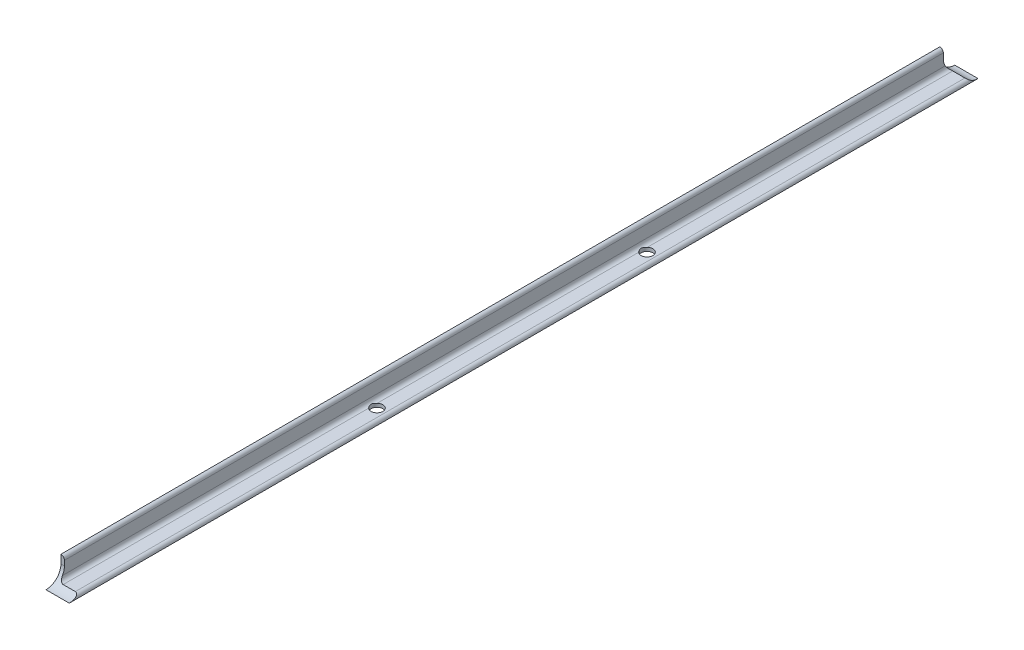
ISO-10303-21;
HEADER;
FILE_DESCRIPTION(('STEP AP214'),'2;1');
FILE_NAME('part.step','',(''),(''),'','','');
FILE_SCHEMA(('AUTOMOTIVE_DESIGN { 1 0 10303 214 1 1 1 1 }'));
ENDSEC;
DATA;
#1=APPLICATION_CONTEXT('core data for automotive mechanical design processes');
#2=APPLICATION_PROTOCOL_DEFINITION('international standard','automotive_design',2000,#1);
#3=PRODUCT_CONTEXT('',#1,'mechanical');
#4=PRODUCT('Part','Part','',(#3));
#5=PRODUCT_RELATED_PRODUCT_CATEGORY('part','',(#4));
#6=PRODUCT_DEFINITION_FORMATION('','',#4);
#7=PRODUCT_DEFINITION_CONTEXT('part definition',#1,'design');
#8=PRODUCT_DEFINITION('design','',#6,#7);
#9=PRODUCT_DEFINITION_SHAPE('','',#8);
#10=(LENGTH_UNIT() NAMED_UNIT(*) SI_UNIT(.MILLI.,.METRE.));
#11=(NAMED_UNIT(*) PLANE_ANGLE_UNIT() SI_UNIT($,.RADIAN.));
#12=(NAMED_UNIT(*) SI_UNIT($,.STERADIAN.) SOLID_ANGLE_UNIT());
#13=UNCERTAINTY_MEASURE_WITH_UNIT(LENGTH_MEASURE(1.E-05),#10,'distance_accuracy_value','');
#14=(GEOMETRIC_REPRESENTATION_CONTEXT(3) GLOBAL_UNCERTAINTY_ASSIGNED_CONTEXT((#13)) GLOBAL_UNIT_ASSIGNED_CONTEXT((#10,
#11,#12)) REPRESENTATION_CONTEXT('',''));
#15=CARTESIAN_POINT('',(0.,0.,0.));
#16=DIRECTION('',(0.,0.,1.));
#17=DIRECTION('',(1.,0.,0.));
#18=AXIS2_PLACEMENT_3D('',#15,#16,#17);
#19=CARTESIAN_POINT('',(3.,17.,181.370967741936));
#20=DIRECTION('',(-1.,0.,0.));
#21=DIRECTION('',(0.,-1.,0.));
#22=AXIS2_PLACEMENT_3D('',#19,#20,#21);
#23=PLANE('',#22);
#24=DIRECTION('',(0.,-1.,0.));
#25=VECTOR('',#24,1.);
#26=CARTESIAN_POINT('',(3.,17.,-586.529040244513));
#27=LINE('',#26,#25);
#28=CARTESIAN_POINT('',(3.,17.,-586.529040244513));
#29=VERTEX_POINT('',#28);
#30=CARTESIAN_POINT('',(3.00000000000001,12.7857012931674,-586.529040244513));
#31=VERTEX_POINT('',#30);
#32=EDGE_CURVE('E275',#29,#31,#27,.T.);
#33=ORIENTED_EDGE('',*,*,#32,.F.);
#34=DIRECTION('',(0.,0.,-1.));
#35=VECTOR('',#34,1.);
#36=CARTESIAN_POINT('',(3.,17.,181.370967741936));
#37=LINE('',#36,#35);
#38=CARTESIAN_POINT('',(3.,17.,168.570975728384));
#39=VERTEX_POINT('',#38);
#40=EDGE_CURVE('E177',#39,#29,#37,.T.);
#41=ORIENTED_EDGE('',*,*,#40,.F.);
#42=DIRECTION('',(0.,-1.,0.));
#43=VECTOR('',#42,1.);
#44=CARTESIAN_POINT('',(3.,17.,168.570975728384));
#45=LINE('',#44,#43);
#46=CARTESIAN_POINT('',(3.00000000000001,12.7857012931674,168.570975728384));
#47=VERTEX_POINT('',#46);
#48=EDGE_CURVE('E194',#39,#47,#45,.T.);
#49=ORIENTED_EDGE('',*,*,#48,.T.);
#50=CARTESIAN_POINT('',(3.,12.8,181.370967741935));
#51=DIRECTION('',(-1.,0.,0.));
#52=DIRECTION('',(0.,-1.,0.));
#53=AXIS2_PLACEMENT_3D('',#50,#51,#52);
#54=CIRCLE('',#53,12.8);
#55=CARTESIAN_POINT('',(3.,6.5,170.228705853073));
#56=VERTEX_POINT('',#55);
#57=EDGE_CURVE('E230',#56,#47,#54,.F.);
#58=ORIENTED_EDGE('',*,*,#57,.F.);
#59=DIRECTION('',(0.,0.,-1.));
#60=VECTOR('',#59,1.);
#61=CARTESIAN_POINT('',(3.,6.5,181.370967741936));
#62=LINE('',#61,#60);
#63=CARTESIAN_POINT('',(3.,6.5,-588.186770369202));
#64=VERTEX_POINT('',#63);
#65=EDGE_CURVE('E172',#56,#64,#62,.T.);
#66=ORIENTED_EDGE('',*,*,#65,.T.);
#67=CARTESIAN_POINT('',(3.,12.8,-599.329032258065));
#68=DIRECTION('',(-1.,0.,0.));
#69=DIRECTION('',(0.,-1.,0.));
#70=AXIS2_PLACEMENT_3D('',#67,#68,#69);
#71=CIRCLE('',#70,12.8);
#72=EDGE_CURVE('E310',#64,#31,#71,.T.);
#73=ORIENTED_EDGE('',*,*,#72,.T.);
#74=EDGE_LOOP('',(#33,#41,#49,#58,#66,#73));
#75=FACE_BOUND('',#74,.T.);
#76=ADVANCED_FACE('F62',(#75),#23,.F.);
#77=CARTESIAN_POINT('',(0.,0.,181.370967741936));
#78=DIRECTION('',(1.,0.,0.));
#79=DIRECTION('',(0.,0.,-1.));
#80=AXIS2_PLACEMENT_3D('',#77,#78,#79);
#81=PLANE('',#80);
#82=DIRECTION('',(0.,-1.,0.));
#83=VECTOR('',#82,1.);
#84=CARTESIAN_POINT('',(0.,0.,-586.529040244513));
#85=LINE('',#84,#83);
#86=CARTESIAN_POINT('',(0.,20.,-586.529040244513));
#87=VERTEX_POINT('',#86);
#88=CARTESIAN_POINT('',(0.,12.7857012931674,-586.529040244513));
#89=VERTEX_POINT('',#88);
#90=EDGE_CURVE('E305',#87,#89,#85,.T.);
#91=ORIENTED_EDGE('',*,*,#90,.T.);
#92=CARTESIAN_POINT('',(0.,12.8,-599.329032258065));
#93=DIRECTION('',(-1.,0.,0.));
#94=DIRECTION('',(0.,0.,1.));
#95=AXIS2_PLACEMENT_3D('',#92,#93,#94);
#96=CIRCLE('',#95,12.8);
#97=CARTESIAN_POINT('',(0.,0.,-599.329032258065));
#98=VERTEX_POINT('',#97);
#99=EDGE_CURVE('E308',#98,#89,#96,.T.);
#100=ORIENTED_EDGE('',*,*,#99,.F.);
#101=DIRECTION('',(0.,0.,-1.));
#102=VECTOR('',#101,1.);
#103=CARTESIAN_POINT('',(0.,0.,181.370967741936));
#104=LINE('',#103,#102);
#105=CARTESIAN_POINT('',(0.,0.,181.370967741936));
#106=VERTEX_POINT('',#105);
#107=EDGE_CURVE('E187',#106,#98,#104,.T.);
#108=ORIENTED_EDGE('',*,*,#107,.F.);
#109=CARTESIAN_POINT('',(0.,12.8,181.370967741935));
#110=DIRECTION('',(-1.,0.,0.));
#111=DIRECTION('',(0.,0.,1.));
#112=AXIS2_PLACEMENT_3D('',#109,#110,#111);
#113=CIRCLE('',#112,12.8);
#114=CARTESIAN_POINT('',(0.,12.7857012931674,168.570975728384));
#115=VERTEX_POINT('',#114);
#116=EDGE_CURVE('E278',#106,#115,#113,.F.);
#117=ORIENTED_EDGE('',*,*,#116,.T.);
#118=DIRECTION('',(0.,-1.,0.));
#119=VECTOR('',#118,1.);
#120=CARTESIAN_POINT('',(0.,0.,168.570975728384));
#121=LINE('',#120,#119);
#122=CARTESIAN_POINT('',(0.,20.,168.570975728384));
#123=VERTEX_POINT('',#122);
#124=EDGE_CURVE('E281',#123,#115,#121,.T.);
#125=ORIENTED_EDGE('',*,*,#124,.F.);
#126=DIRECTION('',(0.,0.,-1.));
#127=VECTOR('',#126,1.);
#128=CARTESIAN_POINT('',(0.,20.,181.370967741936));
#129=LINE('',#128,#127);
#130=EDGE_CURVE('E182',#123,#87,#129,.T.);
#131=ORIENTED_EDGE('',*,*,#130,.T.);
#132=EDGE_LOOP('',(#91,#100,#108,#117,#125,#131));
#133=FACE_BOUND('',#132,.T.);
#134=ADVANCED_FACE('F222',(#133),#81,.F.);
#135=CARTESIAN_POINT('',(0.,17.,181.370967741936));
#136=DIRECTION('',(0.,0.,-1.));
#137=DIRECTION('',(-1.,0.,0.));
#138=AXIS2_PLACEMENT_3D('',#135,#136,#137);
#139=CYLINDRICAL_SURFACE('',#138,3.);
#140=CARTESIAN_POINT('',(0.,17.,-586.529040244513));
#141=DIRECTION('',(0.,0.,-1.));
#142=DIRECTION('',(-1.,0.,0.));
#143=AXIS2_PLACEMENT_3D('',#140,#141,#142);
#144=CIRCLE('',#143,3.);
#145=EDGE_CURVE('E252',#87,#29,#144,.T.);
#146=ORIENTED_EDGE('',*,*,#145,.F.);
#147=ORIENTED_EDGE('',*,*,#130,.F.);
#148=CARTESIAN_POINT('',(0.,17.,168.570975728384));
#149=DIRECTION('',(0.,0.,-1.));
#150=DIRECTION('',(-1.,0.,0.));
#151=AXIS2_PLACEMENT_3D('',#148,#149,#150);
#152=CIRCLE('',#151,3.);
#153=EDGE_CURVE('E198',#123,#39,#152,.T.);
#154=ORIENTED_EDGE('',*,*,#153,.T.);
#155=ORIENTED_EDGE('',*,*,#40,.T.);
#156=EDGE_LOOP('',(#146,#147,#154,#155));
#157=FACE_BOUND('',#156,.T.);
#158=ADVANCED_FACE('F291',(#157),#139,.T.);
#159=CARTESIAN_POINT('',(17.,0.,181.370967741936));
#160=DIRECTION('',(0.,0.,-1.));
#161=DIRECTION('',(-1.,0.,0.));
#162=AXIS2_PLACEMENT_3D('',#159,#160,#161);
#163=CYLINDRICAL_SURFACE('',#162,3.);
#164=DIRECTION('',(0.,0.,-1.));
#165=VECTOR('',#164,1.);
#166=CARTESIAN_POINT('',(20.,0.,181.370967741936));
#167=LINE('',#166,#165);
#168=CARTESIAN_POINT('',(20.,0.,181.370967741936));
#169=VERTEX_POINT('',#168);
#170=CARTESIAN_POINT('',(20.,0.,-599.329032258065));
#171=VERTEX_POINT('',#170);
#172=EDGE_CURVE('E169',#169,#171,#167,.T.);
#173=ORIENTED_EDGE('',*,*,#172,.T.);
#174=CARTESIAN_POINT('',(20.,0.,-599.329032258065));
#175=CARTESIAN_POINT('',(19.9999705919109,-2.30458043371341E-06,-599.151286959261));
#176=CARTESIAN_POINT('',(19.9999989770571,0.00370226592440799,-598.973541801661));
#177=CARTESIAN_POINT('',(19.9999599122282,0.0185087719111506,-598.618355839031));
#178=CARTESIAN_POINT('',(19.9998924600866,0.0296108746273837,-598.440915040973));
#179=CARTESIAN_POINT('',(19.9994499094464,0.0592209383889684,-598.086352009699));
#180=CARTESIAN_POINT('',(19.9990742937025,0.077741324078489,-597.909230814235));
#181=CARTESIAN_POINT('',(19.9975949282692,0.122154254291084,-597.555920397352));
#182=CARTESIAN_POINT('',(19.9964911898514,0.148046684689873,-597.379731161548));
#183=CARTESIAN_POINT('',(19.9929752074295,0.20732959146887,-597.027571761546));
#184=CARTESIAN_POINT('',(19.990555359875,0.240762970703626,-596.851608884925));
#185=CARTESIAN_POINT('',(19.9836522455287,0.31497391630333,-596.501280315793));
#186=CARTESIAN_POINT('',(19.9791690254037,0.355751316557959,-596.326914587251));
#187=CARTESIAN_POINT('',(19.967222709024,0.444514483171897,-595.980308753322));
#188=CARTESIAN_POINT('',(19.9597625459986,0.49249312508781,-595.808066727127));
#189=CARTESIAN_POINT('',(19.9407600650472,0.595547736239818,-595.465970487646));
#190=CARTESIAN_POINT('',(19.9292185156824,0.650622367998193,-595.296115831055));
#191=CARTESIAN_POINT('',(19.9024685493768,0.760575693164327,-594.979685982737));
#192=CARTESIAN_POINT('',(19.887874684371,0.8146679206681,-594.832786020236));
#193=CARTESIAN_POINT('',(19.853481433853,0.927982337980105,-594.541590472269));
#194=CARTESIAN_POINT('',(19.8336823059246,0.987204273846346,-594.397294758309));
#195=CARTESIAN_POINT('',(19.7876954025515,1.11044027648883,-594.111913254042));
#196=CARTESIAN_POINT('',(19.7615123704582,1.17445076092484,-593.970825165116));
#197=CARTESIAN_POINT('',(19.7013693405174,1.30686409439155,-593.692404327919));
#198=CARTESIAN_POINT('',(19.6674102916595,1.37526640670865,-593.555071123687));
#199=CARTESIAN_POINT('',(19.5957588590612,1.5055647848469,-593.304694396706));
#200=CARTESIAN_POINT('',(19.5593322138692,1.56695585378172,-593.191028274171));
#201=CARTESIAN_POINT('',(19.4785163705227,1.69189081979229,-592.967721539012));
#202=CARTESIAN_POINT('',(19.4341258880657,1.75543506276089,-592.858081579115));
#203=CARTESIAN_POINT('',(19.3362692288105,1.88370363459149,-592.643974007168));
#204=CARTESIAN_POINT('',(19.2828231460853,1.94842507345108,-592.539495590787));
#205=CARTESIAN_POINT('',(19.1655479709184,2.0779870281796,-592.336685701539));
#206=CARTESIAN_POINT('',(19.101725952208,2.14282743337525,-592.238350103626));
#207=CARTESIAN_POINT('',(18.9498231644929,2.2826944755246,-592.032154258203));
#208=CARTESIAN_POINT('',(18.859443382443,2.35745098877733,-591.925771184952));
#209=CARTESIAN_POINT('',(18.6607215587141,2.50140061225801,-591.72680223184));
#210=CARTESIAN_POINT('',(18.5523984627188,2.57059947737117,-591.634201992933));
#211=CARTESIAN_POINT('',(18.3377433168696,2.68750138374115,-591.481421994537));
#212=CARTESIAN_POINT('',(18.2343482603597,2.73684935436313,-591.418404616478));
#213=CARTESIAN_POINT('',(18.0157301558413,2.82526779578834,-591.307200865328));
#214=CARTESIAN_POINT('',(17.9005149294212,2.86434500270211,-591.259004768111));
#215=CARTESIAN_POINT('',(17.6772358802355,2.92452271028321,-591.185513498367));
#216=CARTESIAN_POINT('',(17.5703779091804,2.94735939747826,-591.157976395426));
#217=CARTESIAN_POINT('',(17.3522544969218,2.98127870354691,-591.117245847923));
#218=CARTESIAN_POINT('',(17.2409999263105,2.99238863543523,-591.104019071095));
#219=CARTESIAN_POINT('',(17.1077454898132,2.99814309911651,-591.097167444306));
#220=CARTESIAN_POINT('',(17.0862001547962,2.99883941073956,-591.096338319584));
#221=CARTESIAN_POINT('',(17.0431054203398,2.99976710034989,-591.095233756004));
#222=CARTESIAN_POINT('',(17.0215560434937,2.99999891199695,-591.094957800703));
#223=CARTESIAN_POINT('',(17.,3.,-591.094956717969));
#224=B_SPLINE_CURVE_WITH_KNOTS('',3,(#174,#175,#176,#177,#178,#179,#180,#181,#182,#183,#184,
#185,#186,#187,#188,#189,#190,#191,#192,#193,#194,#195,#196,#197,#198,#199,#200,#201,#202,#203,
#204,#205,#206,#207,#208,#209,#210,#211,#212,#213,#214,#215,#216,#217,#218,#219,#220,#221,#222,
#223),.UNSPECIFIED.,.F.,.F.,(4,2,2,2,2,2,2,2,2,2,2,2,2,2,2,2,2,2,2,2,2,2,2,2,4),(0.,
0.533197095279369,1.06640624483348,1.6005122087364,2.13460990476385,2.67182653411145,
3.20903101398106,3.74570747957585,4.28228293803236,4.7537765960874,5.22524692656231,
5.69636800828255,6.1674316247327,6.5698304355134,6.97229419829312,7.37387633093486,
7.77518582667769,8.24881684700335,8.72195092873458,9.11270874235859,9.50320963318574,
9.83984379905434,10.1756921618372,10.2404043939398,10.3050561821395),.UNSPECIFIED.);
#225=CARTESIAN_POINT('',(17.,3.,-591.094956717969));
#226=VERTEX_POINT('',#225);
#227=EDGE_CURVE('E268',#171,#226,#224,.T.);
#228=ORIENTED_EDGE('',*,*,#227,.T.);
#229=DIRECTION('',(0.,0.,-1.));
#230=VECTOR('',#229,1.);
#231=CARTESIAN_POINT('',(17.,3.,181.370967741936));
#232=LINE('',#231,#230);
#233=CARTESIAN_POINT('',(17.,3.,173.13689220184));
#234=VERTEX_POINT('',#233);
#235=EDGE_CURVE('E165',#234,#226,#232,.T.);
#236=ORIENTED_EDGE('',*,*,#235,.F.);
#237=CARTESIAN_POINT('',(20.,0.,181.370967741935));
#238=CARTESIAN_POINT('',(19.9999705919109,-2.30458042971439E-06,181.193222443132));
#239=CARTESIAN_POINT('',(19.9999989770571,0.00370226592441562,181.015477285531));
#240=CARTESIAN_POINT('',(19.9999599122282,0.018508771911162,180.660291322902));
#241=CARTESIAN_POINT('',(19.9998924600866,0.0296108746273938,180.482850524844));
#242=CARTESIAN_POINT('',(19.9994499094464,0.0592209383889723,180.12828749357));
#243=CARTESIAN_POINT('',(19.9990742937025,0.0777413240784908,179.951166298106));
#244=CARTESIAN_POINT('',(19.9975949282692,0.122154254291092,179.597855881223));
#245=CARTESIAN_POINT('',(19.9964911898514,0.14804668468989,179.421666645419));
#246=CARTESIAN_POINT('',(19.9929752074295,0.207329591468899,179.069507245417));
#247=CARTESIAN_POINT('',(19.990555359875,0.240762970703659,178.893544368796));
#248=CARTESIAN_POINT('',(19.9836522455287,0.314973916303364,178.543215799664));
#249=CARTESIAN_POINT('',(19.9791690254037,0.355751316557985,178.368850071122));
#250=CARTESIAN_POINT('',(19.967222709024,0.444514483171921,178.022244237193));
#251=CARTESIAN_POINT('',(19.9597625459986,0.49249312508784,177.850002210998));
#252=CARTESIAN_POINT('',(19.9407600650472,0.595547736239846,177.507905971517));
#253=CARTESIAN_POINT('',(19.9292185156824,0.650622367998212,177.338051314926));
#254=CARTESIAN_POINT('',(19.9024685493768,0.760575693164334,177.021621466608));
#255=CARTESIAN_POINT('',(19.887874684371,0.814667920668103,176.874721504107));
#256=CARTESIAN_POINT('',(19.853481433853,0.927982337980103,176.58352595614));
#257=CARTESIAN_POINT('',(19.8336823059246,0.987204273846344,176.43923024218));
#258=CARTESIAN_POINT('',(19.7876954025515,1.11044027648881,176.153848737913));
#259=CARTESIAN_POINT('',(19.7615123704582,1.1744507609248,176.012760648987));
#260=CARTESIAN_POINT('',(19.7013693405175,1.30686409439148,175.73433981179));
#261=CARTESIAN_POINT('',(19.6674102916596,1.37526640670857,175.597006607558));
#262=CARTESIAN_POINT('',(19.5957588590613,1.50556478484685,175.346629880577));
#263=CARTESIAN_POINT('',(19.5593322138692,1.56695585378169,175.232963758042));
#264=CARTESIAN_POINT('',(19.4785163705227,1.69189081979228,175.009657022883));
#265=CARTESIAN_POINT('',(19.4341258880657,1.75543506276087,174.900017062986));
#266=CARTESIAN_POINT('',(19.3362692288105,1.88370363459147,174.685909491039));
#267=CARTESIAN_POINT('',(19.2828231460854,1.94842507345107,174.581431074658));
#268=CARTESIAN_POINT('',(19.1655479709184,2.07798702817959,174.37862118541));
#269=CARTESIAN_POINT('',(19.101725952208,2.14282743337524,174.280285587497));
#270=CARTESIAN_POINT('',(18.949823164493,2.28269447552458,174.074089742074));
#271=CARTESIAN_POINT('',(18.859443382443,2.35745098877729,173.967706668823));
#272=CARTESIAN_POINT('',(18.6607215587142,2.50140061225799,173.768737715711));
#273=CARTESIAN_POINT('',(18.5523984627189,2.57059947737116,173.676137476804));
#274=CARTESIAN_POINT('',(18.3377433168696,2.68750138374115,173.523357478408));
#275=CARTESIAN_POINT('',(18.2343482603598,2.73684935436311,173.460340100349));
#276=CARTESIAN_POINT('',(18.0157301558414,2.82526779578833,173.349136349199));
#277=CARTESIAN_POINT('',(17.9005149294213,2.8643450027021,173.300940251982));
#278=CARTESIAN_POINT('',(17.6772358802356,2.9245227102832,173.227448982238));
#279=CARTESIAN_POINT('',(17.5703779091804,2.94735939747825,173.199911879297));
#280=CARTESIAN_POINT('',(17.3522544969218,2.9812787035469,173.159181331794));
#281=CARTESIAN_POINT('',(17.2409999263106,2.99238863543523,173.145954554966));
#282=CARTESIAN_POINT('',(17.1077454898132,2.99814309911651,173.139102928177));
#283=CARTESIAN_POINT('',(17.0862001547962,2.99883941073956,173.138273803455));
#284=CARTESIAN_POINT('',(17.0431054203398,2.99976710034989,173.137169239875));
#285=CARTESIAN_POINT('',(17.0215560434937,2.99999891199695,173.136893284574));
#286=CARTESIAN_POINT('',(17.,3.,173.13689220184));
#287=B_SPLINE_CURVE_WITH_KNOTS('',3,(#237,#238,#239,#240,#241,#242,#243,#244,#245,#246,#247,
#248,#249,#250,#251,#252,#253,#254,#255,#256,#257,#258,#259,#260,#261,#262,#263,#264,#265,#266,
#267,#268,#269,#270,#271,#272,#273,#274,#275,#276,#277,#278,#279,#280,#281,#282,#283,#284,#285,
#286),.UNSPECIFIED.,.F.,.F.,(4,2,2,2,2,2,2,2,2,2,2,2,2,2,2,2,2,2,2,2,2,2,2,2,4),(0.,
0.533197095279341,1.06640624483331,1.60051220873628,2.13460990476385,2.67182653411162,
3.20903101398112,3.74570747957588,4.28228293803237,4.75377659608731,5.2252469265622,
5.69636800828244,6.16743162473253,6.56983043551339,6.97229419829308,7.37387633093474,
7.77518582667765,8.24881684700328,8.72195092873456,9.11270874235853,9.50320963318567,
9.83984379905428,10.1756921618371,10.2404043939398,10.3050561821395),.UNSPECIFIED.);
#288=EDGE_CURVE('E201',#169,#234,#287,.T.);
#289=ORIENTED_EDGE('',*,*,#288,.F.);
#290=EDGE_LOOP('',(#173,#228,#236,#289));
#291=FACE_BOUND('',#290,.T.);
#292=ADVANCED_FACE('F210',(#291),#163,.T.);
#293=CARTESIAN_POINT('',(6.5,3.,181.370967741936));
#294=DIRECTION('',(0.,-1.,0.));
#295=DIRECTION('',(0.,0.,-1.));
#296=AXIS2_PLACEMENT_3D('',#293,#294,#295);
#297=PLANE('',#296);
#298=DIRECTION('',(0.,0.,-1.));
#299=VECTOR('',#298,1.);
#300=CARTESIAN_POINT('',(6.5,3.,181.370967741936));
#301=LINE('',#300,#299);
#302=CARTESIAN_POINT('',(6.5,3.,-96.6081858246692));
#303=VERTEX_POINT('',#302);
#304=CARTESIAN_POINT('',(6.5,3.,-321.34987869146));
#305=VERTEX_POINT('',#304);
#306=EDGE_CURVE('E157',#303,#305,#301,.T.);
#307=ORIENTED_EDGE('',*,*,#306,.F.);
#308=CARTESIAN_POINT('',(10.,3.,-92.9790322580645));
#309=DIRECTION('',(0.,-1.,0.));
#310=DIRECTION('',(0.,0.,-1.));
#311=AXIS2_PLACEMENT_3D('',#308,#309,#310);
#312=CIRCLE('',#311,5.0419);
#313=CARTESIAN_POINT('',(6.50000000000004,3.,-89.3498786914598));
#314=VERTEX_POINT('',#313);
#315=EDGE_CURVE('E82',#303,#314,#312,.T.);
#316=ORIENTED_EDGE('',*,*,#315,.T.);
#317=CARTESIAN_POINT('',(6.5,3.,173.13689220184));
#318=VERTEX_POINT('',#317);
#319=EDGE_CURVE('E156',#318,#314,#301,.T.);
#320=ORIENTED_EDGE('',*,*,#319,.F.);
#321=DIRECTION('',(-1.,0.,0.));
#322=VECTOR('',#321,1.);
#323=CARTESIAN_POINT('',(20.,3.,173.13689220184));
#324=LINE('',#323,#322);
#325=EDGE_CURVE('E208',#234,#318,#324,.T.);
#326=ORIENTED_EDGE('',*,*,#325,.F.);
#327=ORIENTED_EDGE('',*,*,#235,.T.);
#328=DIRECTION('',(-1.,0.,0.));
#329=VECTOR('',#328,1.);
#330=CARTESIAN_POINT('',(20.,3.,-591.094956717969));
#331=LINE('',#330,#329);
#332=CARTESIAN_POINT('',(6.5,3.,-591.094956717969));
#333=VERTEX_POINT('',#332);
#334=EDGE_CURVE('E276',#226,#333,#331,.T.);
#335=ORIENTED_EDGE('',*,*,#334,.T.);
#336=CARTESIAN_POINT('',(6.5,3.,-328.608185824669));
#337=VERTEX_POINT('',#336);
#338=EDGE_CURVE('E167',#337,#333,#301,.T.);
#339=ORIENTED_EDGE('',*,*,#338,.F.);
#340=CARTESIAN_POINT('',(10.,3.,-324.979032258065));
#341=DIRECTION('',(0.,-1.,0.));
#342=DIRECTION('',(0.,0.,-1.));
#343=AXIS2_PLACEMENT_3D('',#340,#341,#342);
#344=CIRCLE('',#343,5.0419);
#345=EDGE_CURVE('E88',#337,#305,#344,.T.);
#346=ORIENTED_EDGE('',*,*,#345,.T.);
#347=EDGE_LOOP('',(#307,#316,#320,#326,#327,#335,#339,#346));
#348=FACE_BOUND('',#347,.T.);
#349=ADVANCED_FACE('F154',(#348),#297,.F.);
#350=CARTESIAN_POINT('',(6.5,6.5,181.370967741936));
#351=DIRECTION('',(0.,0.,-1.));
#352=DIRECTION('',(-1.,0.,0.));
#353=AXIS2_PLACEMENT_3D('',#350,#351,#352);
#354=CYLINDRICAL_SURFACE('',#353,3.5);
#355=ORIENTED_EDGE('',*,*,#319,.T.);
#356=CARTESIAN_POINT('',(6.50000000000004,3.,-89.3498786914598));
#357=CARTESIAN_POINT('',(6.39204719065244,3.00001655555881,-89.4539508827214));
#358=CARTESIAN_POINT('',(6.28888615444547,3.0049911532147,-89.5627700011741));
#359=CARTESIAN_POINT('',(6.09302596682158,3.02235029089313,-89.7886493910553));
#360=CARTESIAN_POINT('',(6.00031175048824,3.03472399415071,-89.9056973896282));
#361=CARTESIAN_POINT('',(5.82598131029803,3.06437664200858,-90.1469850670852));
#362=CARTESIAN_POINT('',(5.74435529874184,3.08165121838745,-90.2712182635401));
#363=CARTESIAN_POINT('',(5.59249766633415,3.11879424133783,-90.5261383661917));
#364=CARTESIAN_POINT('',(5.52226932097811,3.13866343060692,-90.656827113579));
#365=CARTESIAN_POINT('',(5.40098938132326,3.17648763076033,-90.9085073506793));
#366=CARTESIAN_POINT('',(5.34866236243366,3.19440098489456,-91.0288932040351));
#367=CARTESIAN_POINT('',(5.25350719060877,3.22909468916167,-91.2735174265388));
#368=CARTESIAN_POINT('',(5.21067819585063,3.24587513961357,-91.3977554531499));
#369=CARTESIAN_POINT('',(5.13482397245432,3.27696180361262,-91.6493480358244));
#370=CARTESIAN_POINT('',(5.10178796429087,3.29127073036559,-91.7766989968934));
#371=CARTESIAN_POINT('',(5.0457189810416,3.31628972163657,-92.0339477565181));
#372=CARTESIAN_POINT('',(5.02268655134614,3.32699958992843,-92.1638456935302));
#373=CARTESIAN_POINT('',(4.98579711282946,3.34442773609418,-92.4330854543745));
#374=CARTESIAN_POINT('',(4.97256326946486,3.35087250450926,-92.5725314793147));
#375=CARTESIAN_POINT('',(4.95775102669115,3.35809978185671,-92.8521923709976));
#376=CARTESIAN_POINT('',(4.95617278555464,3.35888221389965,-92.9924072481548));
#377=CARTESIAN_POINT('',(4.96469564571937,3.35470793773792,-93.2724621978725));
#378=CARTESIAN_POINT('',(4.97480247876197,3.34974841299738,-93.412302052741));
#379=CARTESIAN_POINT('',(5.00656919626948,3.33456610988518,-93.6903623612143));
#380=CARTESIAN_POINT('',(5.02822896466023,3.32434338439375,-93.828582831075));
#381=CARTESIAN_POINT('',(5.08062318999629,3.30060594245812,-94.09120204283));
#382=CARTESIAN_POINT('',(5.11047352677841,3.28742768614895,-94.2158087019582));
#383=CARTESIAN_POINT('',(5.17946312867952,3.25846070448016,-94.4621257203751));
#384=CARTESIAN_POINT('',(5.21860642831008,3.24267084620713,-94.5838347963645));
#385=CARTESIAN_POINT('',(5.34960984978392,3.19313529634966,-94.943631671079));
#386=CARTESIAN_POINT('',(5.45510147125699,3.15719271263381,-95.1766775431546));
#387=CARTESIAN_POINT('',(5.63835128535676,3.10713929871511,-95.5113863830607));
#388=CARTESIAN_POINT('',(5.70327219814427,3.0911586216991,-95.6200447563107));
#389=CARTESIAN_POINT('',(5.8412834015706,3.06182147197259,-95.8324244087791));
#390=CARTESIAN_POINT('',(5.91437115630174,3.04846418819836,-95.9361472063709));
#391=CARTESIAN_POINT('',(6.06854113492248,3.02582049720267,-96.138233778857));
#392=CARTESIAN_POINT('',(6.14963614242337,3.0165407327876,-96.2365885820229));
#393=CARTESIAN_POINT('',(6.31932721465313,3.00363118386693,-96.427183178065));
#394=CARTESIAN_POINT('',(6.407931808024,3.00000791661182,-96.5194158002178));
#395=CARTESIAN_POINT('',(6.50000000000005,3.,-96.6081858246693));
#396=B_SPLINE_CURVE_WITH_KNOTS('',3,(#356,#357,#358,#359,#360,#361,#362,#363,#364,#365,#366,
#367,#368,#369,#370,#371,#372,#373,#374,#375,#376,#377,#378,#379,#380,#381,#382,#383,#384,#385,
#386,#387,#388,#389,#390,#391,#392,#393,#394,#395),.UNSPECIFIED.,.F.,.F.,(4,2,2,2,2,2,2,2,2,2,2,
2,2,2,2,2,2,2,2,4),(0.,0.449398629535669,0.898140674309902,1.34648399845466,1.7949559415619,
2.19202003180166,2.58904891563189,2.98563913738288,3.3822509783317,3.80231758468699,
4.22238989515863,4.64266834618992,5.06294257469716,5.44894233534512,5.83510998406062,
6.60656662240191,6.98902889250302,7.37137273153175,7.75433716934287,8.13774252278028),.UNSPECIFIED.);
#397=EDGE_CURVE('E13',#314,#303,#396,.T.);
#398=ORIENTED_EDGE('',*,*,#397,.T.);
#399=ORIENTED_EDGE('',*,*,#306,.T.);
#400=CARTESIAN_POINT('',(6.5,3.,-321.34987869146));
#401=CARTESIAN_POINT('',(6.39204719065241,3.00001655555881,-321.453950882721));
#402=CARTESIAN_POINT('',(6.28888615444543,3.0049911532147,-321.562770001174));
#403=CARTESIAN_POINT('',(6.09302596682154,3.02235029089314,-321.788649391055));
#404=CARTESIAN_POINT('',(6.0003117504882,3.03472399415071,-321.905697389628));
#405=CARTESIAN_POINT('',(5.82598131029799,3.06437664200858,-322.146985067085));
#406=CARTESIAN_POINT('',(5.74435529874181,3.08165121838746,-322.27121826354));
#407=CARTESIAN_POINT('',(5.59249766633411,3.11879424133784,-322.526138366192));
#408=CARTESIAN_POINT('',(5.52226932097807,3.13866343060693,-322.656827113579));
#409=CARTESIAN_POINT('',(5.40098938132321,3.17648763076034,-322.908507350679));
#410=CARTESIAN_POINT('',(5.34866236243362,3.19440098489458,-323.028893204035));
#411=CARTESIAN_POINT('',(5.25350719060873,3.22909468916168,-323.273517426539));
#412=CARTESIAN_POINT('',(5.2106781958506,3.24587513961358,-323.39775545315));
#413=CARTESIAN_POINT('',(5.13482397245429,3.27696180361263,-323.649348035825));
#414=CARTESIAN_POINT('',(5.10178796429085,3.29127073036559,-323.776698996894));
#415=CARTESIAN_POINT('',(5.04571898104158,3.31628972163658,-324.033947756518));
#416=CARTESIAN_POINT('',(5.02268655134613,3.32699958992843,-324.16384569353));
#417=CARTESIAN_POINT('',(4.98579711282945,3.34442773609418,-324.433085454375));
#418=CARTESIAN_POINT('',(4.97256326946486,3.35087250450926,-324.572531479315));
#419=CARTESIAN_POINT('',(4.95775102669115,3.35809978185671,-324.852192370998));
#420=CARTESIAN_POINT('',(4.95617278555464,3.35888221389965,-324.992407248155));
#421=CARTESIAN_POINT('',(4.96469564571937,3.35470793773792,-325.272462197872));
#422=CARTESIAN_POINT('',(4.97480247876197,3.34974841299738,-325.412302052741));
#423=CARTESIAN_POINT('',(5.00656919626949,3.33456610988517,-325.690362361214));
#424=CARTESIAN_POINT('',(5.02822896466025,3.32434338439374,-325.828582831075));
#425=CARTESIAN_POINT('',(5.0806231899963,3.30060594245811,-326.09120204283));
#426=CARTESIAN_POINT('',(5.11047352677841,3.28742768614895,-326.215808701958));
#427=CARTESIAN_POINT('',(5.17946312867952,3.25846070448016,-326.462125720375));
#428=CARTESIAN_POINT('',(5.21860642831009,3.24267084620713,-326.583834796365));
#429=CARTESIAN_POINT('',(5.34960984978393,3.19313529634966,-326.943631671079));
#430=CARTESIAN_POINT('',(5.455101471257,3.15719271263381,-327.176677543155));
#431=CARTESIAN_POINT('',(5.63835128535677,3.10713929871511,-327.511386383061));
#432=CARTESIAN_POINT('',(5.70327219814429,3.0911586216991,-327.620044756311));
#433=CARTESIAN_POINT('',(5.84128340157061,3.06182147197259,-327.832424408779));
#434=CARTESIAN_POINT('',(5.91437115630175,3.04846418819836,-327.936147206371));
#435=CARTESIAN_POINT('',(6.06854113492248,3.02582049720267,-328.138233778857));
#436=CARTESIAN_POINT('',(6.14963614242337,3.0165407327876,-328.236588582023));
#437=CARTESIAN_POINT('',(6.31932721465313,3.00363118386693,-328.427183178065));
#438=CARTESIAN_POINT('',(6.407931808024,3.00000791661182,-328.519415800218));
#439=CARTESIAN_POINT('',(6.50000000000004,3.,-328.608185824669));
#440=B_SPLINE_CURVE_WITH_KNOTS('',3,(#400,#401,#402,#403,#404,#405,#406,#407,#408,#409,#410,
#411,#412,#413,#414,#415,#416,#417,#418,#419,#420,#421,#422,#423,#424,#425,#426,#427,#428,#429,
#430,#431,#432,#433,#434,#435,#436,#437,#438,#439),.UNSPECIFIED.,.F.,.F.,(4,2,2,2,2,2,2,2,2,2,2,
2,2,2,2,2,2,2,2,4),(0.,0.449398629535646,0.898140674309864,1.34648399845468,1.79495594156189,
2.19202003180167,2.58904891563188,2.98563913738291,3.38225097833168,3.8023175846869,
4.22238989515854,4.64266834618991,5.06294257469713,5.44894233534504,5.83510998406057,
6.60656662240186,6.98902889250294,7.37137273153168,7.75433716934277,8.13774252278019),.UNSPECIFIED.);
#441=EDGE_CURVE('E76',#305,#337,#440,.T.);
#442=ORIENTED_EDGE('',*,*,#441,.T.);
#443=ORIENTED_EDGE('',*,*,#338,.T.);
#444=CARTESIAN_POINT('',(6.5,3.,-591.094956717969));
#445=CARTESIAN_POINT('',(6.42259108530009,2.99997615779608,-591.094996537555));
#446=CARTESIAN_POINT('',(6.34521049613183,3.00256706100367,-591.091901618388));
#447=CARTESIAN_POINT('',(6.19136579467075,3.01278988354558,-591.079751637456));
#448=CARTESIAN_POINT('',(6.11490049437667,3.02041432834783,-591.070705413121));
#449=CARTESIAN_POINT('',(5.96446156854596,3.04039073339572,-591.047109358543));
#450=CARTESIAN_POINT('',(5.89046872198489,3.05268221409427,-591.032629963194));
#451=CARTESIAN_POINT('',(5.74453320695994,3.08169470633635,-590.998663424474));
#452=CARTESIAN_POINT('',(5.67259118600824,3.0984171000762,-590.979174718536));
#453=CARTESIAN_POINT('',(5.46134232275793,3.15451109226657,-590.914296116561));
#454=CARTESIAN_POINT('',(5.32560308966285,3.19995076456173,-590.862322493928));
#455=CARTESIAN_POINT('',(5.06521771658116,3.30449808161047,-590.745230993141));
#456=CARTESIAN_POINT('',(4.94061599472349,3.36365734275348,-590.680063597462));
#457=CARTESIAN_POINT('',(4.63495085625347,3.53066685700255,-590.500572301217));
#458=CARTESIAN_POINT('',(4.46243245339309,3.64699617808637,-590.379474287121));
#459=CARTESIAN_POINT('',(4.22487160874181,3.83839199521031,-590.189128711305));
#460=CARTESIAN_POINT('',(4.14913969907255,3.90510128800766,-590.124143998457));
#461=CARTESIAN_POINT('',(4.0045930133133,4.04379057810759,-589.992119589677));
#462=CARTESIAN_POINT('',(3.93577730321152,4.11576986143843,-589.925080172825));
#463=CARTESIAN_POINT('',(3.73532294750269,4.34396280941257,-589.717658385234));
#464=CARTESIAN_POINT('',(3.61483446400872,4.50824201431268,-589.575206942417));
#465=CARTESIAN_POINT('',(3.40405625194773,4.85495554091959,-589.290782227691));
#466=CARTESIAN_POINT('',(3.31371585356483,5.03735872506833,-589.148808554526));
#467=CARTESIAN_POINT('',(3.20100978506625,5.32618157593827,-588.936869123931));
#468=CARTESIAN_POINT('',(3.16686594513598,5.42686221514027,-588.865170639577));
#469=CARTESIAN_POINT('',(3.10764061744334,5.63207157635462,-588.723546626915));
#470=CARTESIAN_POINT('',(3.08255760993691,5.73659964980548,-588.653620803115));
#471=CARTESIAN_POINT('',(3.04188178935847,5.94937350227179,-588.515845413362));
#472=CARTESIAN_POINT('',(3.02632271989439,6.05763108089708,-588.448004029509));
#473=CARTESIAN_POINT('',(3.00537924035695,6.27691986485618,-588.315132728058));
#474=CARTESIAN_POINT('',(3.0000020145823,6.3879529726719,-588.250104827241));
#475=CARTESIAN_POINT('',(3.,6.4999999999999,-588.186770369202));
#476=B_SPLINE_CURVE_WITH_KNOTS('',3,(#444,#445,#446,#447,#448,#449,#450,#451,#452,#453,#454,
#455,#456,#457,#458,#459,#460,#461,#462,#463,#464,#465,#466,#467,#468,#469,#470,#471,#472,#473,
#474,#475),.UNSPECIFIED.,.F.,.F.,(4,2,2,2,2,2,2,2,2,2,2,2,2,2,2,4),(0.,0.232076005603776,
0.463808163942154,0.69263451656808,0.921532334387826,1.37626948241981,1.83274604120003,
2.5507160064775,2.91059905792619,3.27043344276822,4.0135090170559,4.75532934117933,
5.13969299148201,5.52399214374852,5.90964511571624,6.29557010277973),.UNSPECIFIED.);
#477=EDGE_CURVE('E239',#333,#64,#476,.T.);
#478=ORIENTED_EDGE('',*,*,#477,.T.);
#479=ORIENTED_EDGE('',*,*,#65,.F.);
#480=CARTESIAN_POINT('',(6.5,3.,173.13689220184));
#481=CARTESIAN_POINT('',(6.42259108530009,2.99997615779608,173.136932021426));
#482=CARTESIAN_POINT('',(6.34521049613182,3.00256706100367,173.133837102259));
#483=CARTESIAN_POINT('',(6.19136579467073,3.01278988354558,173.121687121327));
#484=CARTESIAN_POINT('',(6.11490049437666,3.02041432834784,173.112640896992));
#485=CARTESIAN_POINT('',(5.96446156854595,3.04039073339572,173.089044842414));
#486=CARTESIAN_POINT('',(5.89046872198488,3.05268221409427,173.074565447065));
#487=CARTESIAN_POINT('',(5.74453320695993,3.08169470633635,173.040598908345));
#488=CARTESIAN_POINT('',(5.67259118600823,3.0984171000762,173.021110202407));
#489=CARTESIAN_POINT('',(5.46134232275791,3.15451109226657,172.956231600432));
#490=CARTESIAN_POINT('',(5.32560308966282,3.19995076456174,172.904257977799));
#491=CARTESIAN_POINT('',(5.06521771658113,3.30449808161048,172.787166477012));
#492=CARTESIAN_POINT('',(4.94061599472347,3.36365734275349,172.721999081333));
#493=CARTESIAN_POINT('',(4.63495085625348,3.53066685700255,172.542507785088));
#494=CARTESIAN_POINT('',(4.4624324533931,3.64699617808637,172.421409770992));
#495=CARTESIAN_POINT('',(4.22487160874184,3.83839199521029,172.231064195176));
#496=CARTESIAN_POINT('',(4.14913969907258,3.90510128800764,172.166079482328));
#497=CARTESIAN_POINT('',(4.00459301331333,4.04379057810757,172.034055073548));
#498=CARTESIAN_POINT('',(3.93577730321153,4.11576986143841,171.967015656696));
#499=CARTESIAN_POINT('',(3.7353229475027,4.34396280941256,171.759593869105));
#500=CARTESIAN_POINT('',(3.61483446400874,4.50824201431265,171.617142426288));
#501=CARTESIAN_POINT('',(3.40405625194774,4.85495554091958,171.332717711562));
#502=CARTESIAN_POINT('',(3.31371585356482,5.03735872506836,171.190744038397));
#503=CARTESIAN_POINT('',(3.20100978506625,5.32618157593829,170.978804607802));
#504=CARTESIAN_POINT('',(3.16686594513598,5.42686221514028,170.907106123448));
#505=CARTESIAN_POINT('',(3.10764061744334,5.63207157635463,170.765482110786));
#506=CARTESIAN_POINT('',(3.0825576099369,5.73659964980552,170.695556286986));
#507=CARTESIAN_POINT('',(3.04188178935846,5.94937350227184,170.557780897233));
#508=CARTESIAN_POINT('',(3.02632271989439,6.05763108089712,170.48993951338));
#509=CARTESIAN_POINT('',(3.00537924035695,6.27691986485622,170.357068211929));
#510=CARTESIAN_POINT('',(3.0000020145823,6.38795297267195,170.292040311112));
#511=CARTESIAN_POINT('',(3.,6.5,170.228705853073));
#512=B_SPLINE_CURVE_WITH_KNOTS('',3,(#480,#481,#482,#483,#484,#485,#486,#487,#488,#489,#490,
#491,#492,#493,#494,#495,#496,#497,#498,#499,#500,#501,#502,#503,#504,#505,#506,#507,#508,#509,
#510,#511),.UNSPECIFIED.,.F.,.F.,(4,2,2,2,2,2,2,2,2,2,2,2,2,2,2,4),(0.,0.232076005603784,
0.463808163942164,0.692634516568066,0.921532334387819,1.37626948241986,1.83274604120005,
2.55071600647745,2.91059905792613,3.27043344276819,4.0135090170559,4.75532934117932,
5.139692991482,5.52399214374856,5.9096451157163,6.29557010277982),.UNSPECIFIED.);
#513=EDGE_CURVE('E164',#318,#56,#512,.T.);
#514=ORIENTED_EDGE('',*,*,#513,.F.);
#515=EDGE_LOOP('',(#355,#398,#399,#442,#443,#478,#479,#514));
#516=FACE_BOUND('',#515,.T.);
#517=ADVANCED_FACE('F162',(#516),#354,.F.);
#518=CARTESIAN_POINT('',(20.,0.,181.370967741936));
#519=DIRECTION('',(0.,1.,0.));
#520=DIRECTION('',(0.,0.,1.));
#521=AXIS2_PLACEMENT_3D('',#518,#519,#520);
#522=PLANE('',#521);
#523=CARTESIAN_POINT('',(10.,0.,-92.9790322580645));
#524=DIRECTION('',(0.,-1.,0.));
#525=DIRECTION('',(0.,0.,-1.));
#526=AXIS2_PLACEMENT_3D('',#523,#524,#525);
#527=CIRCLE('',#526,5.0419);
#528=CARTESIAN_POINT('',(10.,0.,-98.0209322580645));
#529=VERTEX_POINT('',#528);
#530=EDGE_CURVE('E159',#529,#529,#527,.T.);
#531=ORIENTED_EDGE('',*,*,#530,.F.);
#532=EDGE_LOOP('',(#531));
#533=FACE_BOUND('',#532,.T.);
#534=CARTESIAN_POINT('',(10.,0.,-324.979032258065));
#535=DIRECTION('',(0.,-1.,0.));
#536=DIRECTION('',(0.,0.,-1.));
#537=AXIS2_PLACEMENT_3D('',#534,#535,#536);
#538=CIRCLE('',#537,5.0419);
#539=CARTESIAN_POINT('',(10.,0.,-330.020932258064));
#540=VERTEX_POINT('',#539);
#541=EDGE_CURVE('E158',#540,#540,#538,.T.);
#542=ORIENTED_EDGE('',*,*,#541,.F.);
#543=EDGE_LOOP('',(#542));
#544=FACE_BOUND('',#543,.T.);
#545=DIRECTION('',(1.,0.,0.));
#546=VECTOR('',#545,1.);
#547=CARTESIAN_POINT('',(20.,0.,-599.329032258065));
#548=LINE('',#547,#546);
#549=EDGE_CURVE('E191',#98,#171,#548,.T.);
#550=ORIENTED_EDGE('',*,*,#549,.T.);
#551=ORIENTED_EDGE('',*,*,#172,.F.);
#552=DIRECTION('',(1.,0.,0.));
#553=VECTOR('',#552,1.);
#554=CARTESIAN_POINT('',(20.,0.,181.370967741936));
#555=LINE('',#554,#553);
#556=EDGE_CURVE('E190',#106,#169,#555,.T.);
#557=ORIENTED_EDGE('',*,*,#556,.F.);
#558=ORIENTED_EDGE('',*,*,#107,.T.);
#559=EDGE_LOOP('',(#550,#551,#557,#558));
#560=FACE_BOUND('',#559,.T.);
#561=ADVANCED_FACE('F64',(#533,#544,#560),#522,.F.);
#562=CARTESIAN_POINT('',(20.,0.,168.570975728384));
#563=DIRECTION('',(0.,0.,-1.));
#564=DIRECTION('',(-1.,0.,0.));
#565=AXIS2_PLACEMENT_3D('',#562,#563,#564);
#566=PLANE('',#565);
#567=ORIENTED_EDGE('',*,*,#153,.F.);
#568=ORIENTED_EDGE('',*,*,#124,.T.);
#569=DIRECTION('',(-1.,0.,0.));
#570=VECTOR('',#569,1.);
#571=CARTESIAN_POINT('',(20.,12.7857012931674,168.570975728384));
#572=LINE('',#571,#570);
#573=EDGE_CURVE('E283',#47,#115,#572,.T.);
#574=ORIENTED_EDGE('',*,*,#573,.F.);
#575=ORIENTED_EDGE('',*,*,#48,.F.);
#576=EDGE_LOOP('',(#567,#568,#574,#575));
#577=FACE_BOUND('',#576,.T.);
#578=ADVANCED_FACE('F219',(#577),#566,.F.);
#579=CARTESIAN_POINT('',(20.,12.8,181.370967741935));
#580=DIRECTION('',(-1.,0.,0.));
#581=DIRECTION('',(0.,0.,1.));
#582=AXIS2_PLACEMENT_3D('',#579,#580,#581);
#583=CYLINDRICAL_SURFACE('',#582,12.8);
#584=ORIENTED_EDGE('',*,*,#288,.T.);
#585=ORIENTED_EDGE('',*,*,#325,.T.);
#586=ORIENTED_EDGE('',*,*,#513,.T.);
#587=ORIENTED_EDGE('',*,*,#57,.T.);
#588=ORIENTED_EDGE('',*,*,#573,.T.);
#589=ORIENTED_EDGE('',*,*,#116,.F.);
#590=ORIENTED_EDGE('',*,*,#556,.T.);
#591=EDGE_LOOP('',(#584,#585,#586,#587,#588,#589,#590));
#592=FACE_BOUND('',#591,.T.);
#593=ADVANCED_FACE('F213',(#592),#583,.F.);
#594=CARTESIAN_POINT('',(20.,0.,-586.529040244513));
#595=DIRECTION('',(0.,0.,-1.));
#596=DIRECTION('',(-1.,0.,0.));
#597=AXIS2_PLACEMENT_3D('',#594,#595,#596);
#598=PLANE('',#597);
#599=ORIENTED_EDGE('',*,*,#32,.T.);
#600=DIRECTION('',(-1.,0.,0.));
#601=VECTOR('',#600,1.);
#602=CARTESIAN_POINT('',(20.,12.7857012931674,-586.529040244513));
#603=LINE('',#602,#601);
#604=EDGE_CURVE('E306',#31,#89,#603,.T.);
#605=ORIENTED_EDGE('',*,*,#604,.T.);
#606=ORIENTED_EDGE('',*,*,#90,.F.);
#607=ORIENTED_EDGE('',*,*,#145,.T.);
#608=EDGE_LOOP('',(#599,#605,#606,#607));
#609=FACE_BOUND('',#608,.T.);
#610=ADVANCED_FACE('F218',(#609),#598,.T.);
#611=CARTESIAN_POINT('',(20.,12.8,-599.329032258065));
#612=DIRECTION('',(-1.,0.,0.));
#613=DIRECTION('',(0.,0.,1.));
#614=AXIS2_PLACEMENT_3D('',#611,#612,#613);
#615=CYLINDRICAL_SURFACE('',#614,12.8);
#616=ORIENTED_EDGE('',*,*,#549,.F.);
#617=ORIENTED_EDGE('',*,*,#99,.T.);
#618=ORIENTED_EDGE('',*,*,#604,.F.);
#619=ORIENTED_EDGE('',*,*,#72,.F.);
#620=ORIENTED_EDGE('',*,*,#477,.F.);
#621=ORIENTED_EDGE('',*,*,#334,.F.);
#622=ORIENTED_EDGE('',*,*,#227,.F.);
#623=EDGE_LOOP('',(#616,#617,#618,#619,#620,#621,#622));
#624=FACE_BOUND('',#623,.T.);
#625=ADVANCED_FACE('F258',(#624),#615,.F.);
#626=CARTESIAN_POINT('',(10.,0.,-324.979032258065));
#627=DIRECTION('',(0.,-1.,0.));
#628=DIRECTION('',(0.,0.,-1.));
#629=AXIS2_PLACEMENT_3D('',#626,#627,#628);
#630=CYLINDRICAL_SURFACE('',#629,5.0419);
#631=ORIENTED_EDGE('',*,*,#541,.T.);
#632=EDGE_LOOP('',(#631));
#633=FACE_BOUND('',#632,.T.);
#634=ORIENTED_EDGE('',*,*,#441,.F.);
#635=ORIENTED_EDGE('',*,*,#345,.F.);
#636=EDGE_LOOP('',(#634,#635));
#637=FACE_BOUND('',#636,.T.);
#638=ADVANCED_FACE('F254',(#633,#637),#630,.F.);
#639=CARTESIAN_POINT('',(10.,0.,-92.9790322580645));
#640=DIRECTION('',(0.,-1.,0.));
#641=DIRECTION('',(0.,0.,-1.));
#642=AXIS2_PLACEMENT_3D('',#639,#640,#641);
#643=CYLINDRICAL_SURFACE('',#642,5.0419);
#644=ORIENTED_EDGE('',*,*,#530,.T.);
#645=EDGE_LOOP('',(#644));
#646=FACE_BOUND('',#645,.T.);
#647=ORIENTED_EDGE('',*,*,#397,.F.);
#648=ORIENTED_EDGE('',*,*,#315,.F.);
#649=EDGE_LOOP('',(#647,#648));
#650=FACE_BOUND('',#649,.T.);
#651=ADVANCED_FACE('F148',(#646,#650),#643,.F.);
#652=CLOSED_SHELL('',(#76,#134,#158,#292,#349,#517,#561,#578,#593,#610,#625,#638,#651));
#653=MANIFOLD_SOLID_BREP('B2',#652);
#654=ADVANCED_BREP_SHAPE_REPRESENTATION('',(#18,#653),#14);
#655=SHAPE_DEFINITION_REPRESENTATION(#9,#654);
ENDSEC;
END-ISO-10303-21;
